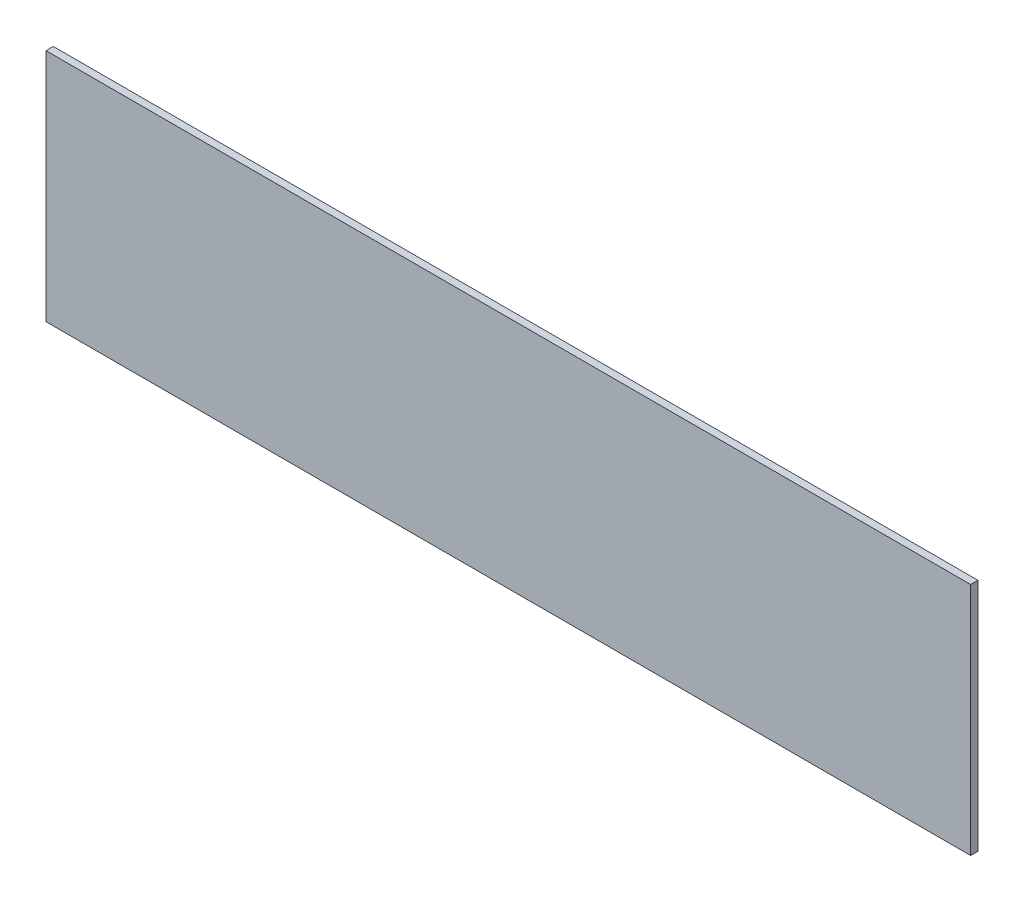
ISO-10303-21;
HEADER;
FILE_DESCRIPTION(('STEP AP214'),'2;1');
FILE_NAME('part.step','',(''),(''),'','','');
FILE_SCHEMA(('AUTOMOTIVE_DESIGN { 1 0 10303 214 1 1 1 1 }'));
ENDSEC;
DATA;
#1=APPLICATION_CONTEXT('core data for automotive mechanical design processes');
#2=APPLICATION_PROTOCOL_DEFINITION('international standard','automotive_design',2000,#1);
#3=PRODUCT_CONTEXT('',#1,'mechanical');
#4=PRODUCT('Part','Part','',(#3));
#5=PRODUCT_RELATED_PRODUCT_CATEGORY('part','',(#4));
#6=PRODUCT_DEFINITION_FORMATION('','',#4);
#7=PRODUCT_DEFINITION_CONTEXT('part definition',#1,'design');
#8=PRODUCT_DEFINITION('design','',#6,#7);
#9=PRODUCT_DEFINITION_SHAPE('','',#8);
#10=(LENGTH_UNIT() NAMED_UNIT(*) SI_UNIT(.MILLI.,.METRE.));
#11=(NAMED_UNIT(*) PLANE_ANGLE_UNIT() SI_UNIT($,.RADIAN.));
#12=(NAMED_UNIT(*) SI_UNIT($,.STERADIAN.) SOLID_ANGLE_UNIT());
#13=UNCERTAINTY_MEASURE_WITH_UNIT(LENGTH_MEASURE(1.E-05),#10,'distance_accuracy_value','');
#14=(GEOMETRIC_REPRESENTATION_CONTEXT(3) GLOBAL_UNCERTAINTY_ASSIGNED_CONTEXT((#13)) GLOBAL_UNIT_ASSIGNED_CONTEXT((#10,
#11,#12)) REPRESENTATION_CONTEXT('',''));
#15=CARTESIAN_POINT('',(0.,0.,0.));
#16=DIRECTION('',(0.,0.,1.));
#17=DIRECTION('',(1.,0.,0.));
#18=AXIS2_PLACEMENT_3D('',#15,#16,#17);
#19=CARTESIAN_POINT('',(149.85,38.0375,2.38125));
#20=DIRECTION('',(-1.,0.,0.));
#21=DIRECTION('',(0.,0.,1.));
#22=AXIS2_PLACEMENT_3D('',#19,#20,#21);
#23=PLANE('',#22);
#24=DIRECTION('',(0.,1.,0.));
#25=VECTOR('',#24,1.);
#26=CARTESIAN_POINT('',(149.85,38.0375,0.));
#27=LINE('',#26,#25);
#28=CARTESIAN_POINT('',(149.85,-38.0375,0.));
#29=VERTEX_POINT('',#28);
#30=CARTESIAN_POINT('',(149.85,38.0375,0.));
#31=VERTEX_POINT('',#30);
#32=EDGE_CURVE('E104',#29,#31,#27,.T.);
#33=ORIENTED_EDGE('',*,*,#32,.T.);
#34=DIRECTION('',(0.,0.,-1.));
#35=VECTOR('',#34,1.);
#36=CARTESIAN_POINT('',(149.85,38.0375,2.38125));
#37=LINE('',#36,#35);
#38=CARTESIAN_POINT('',(149.85,38.0375,2.38125));
#39=VERTEX_POINT('',#38);
#40=EDGE_CURVE('E11',#39,#31,#37,.T.);
#41=ORIENTED_EDGE('',*,*,#40,.F.);
#42=DIRECTION('',(0.,1.,0.));
#43=VECTOR('',#42,1.);
#44=CARTESIAN_POINT('',(149.85,38.0375,2.38125));
#45=LINE('',#44,#43);
#46=CARTESIAN_POINT('',(149.85,-38.0375,2.38125));
#47=VERTEX_POINT('',#46);
#48=EDGE_CURVE('E92',#47,#39,#45,.T.);
#49=ORIENTED_EDGE('',*,*,#48,.F.);
#50=DIRECTION('',(0.,0.,-1.));
#51=VECTOR('',#50,1.);
#52=CARTESIAN_POINT('',(149.85,-38.0375,2.38125));
#53=LINE('',#52,#51);
#54=EDGE_CURVE('E100',#47,#29,#53,.T.);
#55=ORIENTED_EDGE('',*,*,#54,.T.);
#56=EDGE_LOOP('',(#33,#41,#49,#55));
#57=FACE_BOUND('',#56,.T.);
#58=ADVANCED_FACE('F41',(#57),#23,.F.);
#59=CARTESIAN_POINT('',(-149.85,38.0375,2.38125));
#60=DIRECTION('',(0.,-1.,0.));
#61=DIRECTION('',(0.,0.,-1.));
#62=AXIS2_PLACEMENT_3D('',#59,#60,#61);
#63=PLANE('',#62);
#64=DIRECTION('',(-1.,0.,0.));
#65=VECTOR('',#64,1.);
#66=CARTESIAN_POINT('',(-149.85,38.0375,0.));
#67=LINE('',#66,#65);
#68=CARTESIAN_POINT('',(-149.85,38.0375,0.));
#69=VERTEX_POINT('',#68);
#70=EDGE_CURVE('E96',#31,#69,#67,.T.);
#71=ORIENTED_EDGE('',*,*,#70,.T.);
#72=DIRECTION('',(0.,0.,-1.));
#73=VECTOR('',#72,1.);
#74=CARTESIAN_POINT('',(-149.85,38.0375,2.38125));
#75=LINE('',#74,#73);
#76=CARTESIAN_POINT('',(-149.85,38.0375,2.38125));
#77=VERTEX_POINT('',#76);
#78=EDGE_CURVE('E49',#77,#69,#75,.T.);
#79=ORIENTED_EDGE('',*,*,#78,.F.);
#80=DIRECTION('',(-1.,0.,0.));
#81=VECTOR('',#80,1.);
#82=CARTESIAN_POINT('',(-149.85,38.0375,2.38125));
#83=LINE('',#82,#81);
#84=EDGE_CURVE('E87',#39,#77,#83,.T.);
#85=ORIENTED_EDGE('',*,*,#84,.F.);
#86=ORIENTED_EDGE('',*,*,#40,.T.);
#87=EDGE_LOOP('',(#71,#79,#85,#86));
#88=FACE_BOUND('',#87,.T.);
#89=ADVANCED_FACE('F95',(#88),#63,.F.);
#90=CARTESIAN_POINT('',(-149.85,38.0375,2.38125));
#91=DIRECTION('',(1.,0.,0.));
#92=DIRECTION('',(0.,0.,-1.));
#93=AXIS2_PLACEMENT_3D('',#90,#91,#92);
#94=PLANE('',#93);
#95=DIRECTION('',(0.,-1.,0.));
#96=VECTOR('',#95,1.);
#97=CARTESIAN_POINT('',(-149.85,38.0375,0.));
#98=LINE('',#97,#96);
#99=CARTESIAN_POINT('',(-149.85,-38.0375,0.));
#100=VERTEX_POINT('',#99);
#101=EDGE_CURVE('E74',#69,#100,#98,.T.);
#102=ORIENTED_EDGE('',*,*,#101,.T.);
#103=DIRECTION('',(0.,0.,-1.));
#104=VECTOR('',#103,1.);
#105=CARTESIAN_POINT('',(-149.85,-38.0375,2.38125));
#106=LINE('',#105,#104);
#107=CARTESIAN_POINT('',(-149.85,-38.0375,2.38125));
#108=VERTEX_POINT('',#107);
#109=EDGE_CURVE('E97',#108,#100,#106,.T.);
#110=ORIENTED_EDGE('',*,*,#109,.F.);
#111=DIRECTION('',(0.,-1.,0.));
#112=VECTOR('',#111,1.);
#113=CARTESIAN_POINT('',(-149.85,38.0375,2.38125));
#114=LINE('',#113,#112);
#115=EDGE_CURVE('E90',#77,#108,#114,.T.);
#116=ORIENTED_EDGE('',*,*,#115,.F.);
#117=ORIENTED_EDGE('',*,*,#78,.T.);
#118=EDGE_LOOP('',(#102,#110,#116,#117));
#119=FACE_BOUND('',#118,.T.);
#120=ADVANCED_FACE('F98',(#119),#94,.F.);
#121=CARTESIAN_POINT('',(-149.85,-38.0375,2.38125));
#122=DIRECTION('',(0.,1.,0.));
#123=DIRECTION('',(0.,0.,1.));
#124=AXIS2_PLACEMENT_3D('',#121,#122,#123);
#125=PLANE('',#124);
#126=DIRECTION('',(1.,0.,0.));
#127=VECTOR('',#126,1.);
#128=CARTESIAN_POINT('',(-149.85,-38.0375,0.));
#129=LINE('',#128,#127);
#130=EDGE_CURVE('E80',#100,#29,#129,.T.);
#131=ORIENTED_EDGE('',*,*,#130,.T.);
#132=ORIENTED_EDGE('',*,*,#54,.F.);
#133=DIRECTION('',(1.,0.,0.));
#134=VECTOR('',#133,1.);
#135=CARTESIAN_POINT('',(-149.85,-38.0375,2.38125));
#136=LINE('',#135,#134);
#137=EDGE_CURVE('E57',#108,#47,#136,.T.);
#138=ORIENTED_EDGE('',*,*,#137,.F.);
#139=ORIENTED_EDGE('',*,*,#109,.T.);
#140=EDGE_LOOP('',(#131,#132,#138,#139));
#141=FACE_BOUND('',#140,.T.);
#142=ADVANCED_FACE('F111',(#141),#125,.F.);
#143=CARTESIAN_POINT('',(0.,0.,2.38125));
#144=DIRECTION('',(0.,0.,1.));
#145=DIRECTION('',(1.,0.,0.));
#146=AXIS2_PLACEMENT_3D('',#143,#144,#145);
#147=PLANE('',#146);
#148=ORIENTED_EDGE('',*,*,#48,.T.);
#149=ORIENTED_EDGE('',*,*,#84,.T.);
#150=ORIENTED_EDGE('',*,*,#115,.T.);
#151=ORIENTED_EDGE('',*,*,#137,.T.);
#152=EDGE_LOOP('',(#148,#149,#150,#151));
#153=FACE_BOUND('',#152,.T.);
#154=ADVANCED_FACE('F88',(#153),#147,.T.);
#155=CARTESIAN_POINT('',(0.,0.,0.));
#156=DIRECTION('',(0.,0.,1.));
#157=DIRECTION('',(1.,0.,0.));
#158=AXIS2_PLACEMENT_3D('',#155,#156,#157);
#159=PLANE('',#158);
#160=ORIENTED_EDGE('',*,*,#32,.F.);
#161=ORIENTED_EDGE('',*,*,#130,.F.);
#162=ORIENTED_EDGE('',*,*,#101,.F.);
#163=ORIENTED_EDGE('',*,*,#70,.F.);
#164=EDGE_LOOP('',(#160,#161,#162,#163));
#165=FACE_BOUND('',#164,.T.);
#166=ADVANCED_FACE('F114',(#165),#159,.F.);
#167=CLOSED_SHELL('',(#58,#89,#120,#142,#154,#166));
#168=MANIFOLD_SOLID_BREP('B2',#167);
#169=ADVANCED_BREP_SHAPE_REPRESENTATION('',(#18,#168),#14);
#170=SHAPE_DEFINITION_REPRESENTATION(#9,#169);
ENDSEC;
END-ISO-10303-21;
